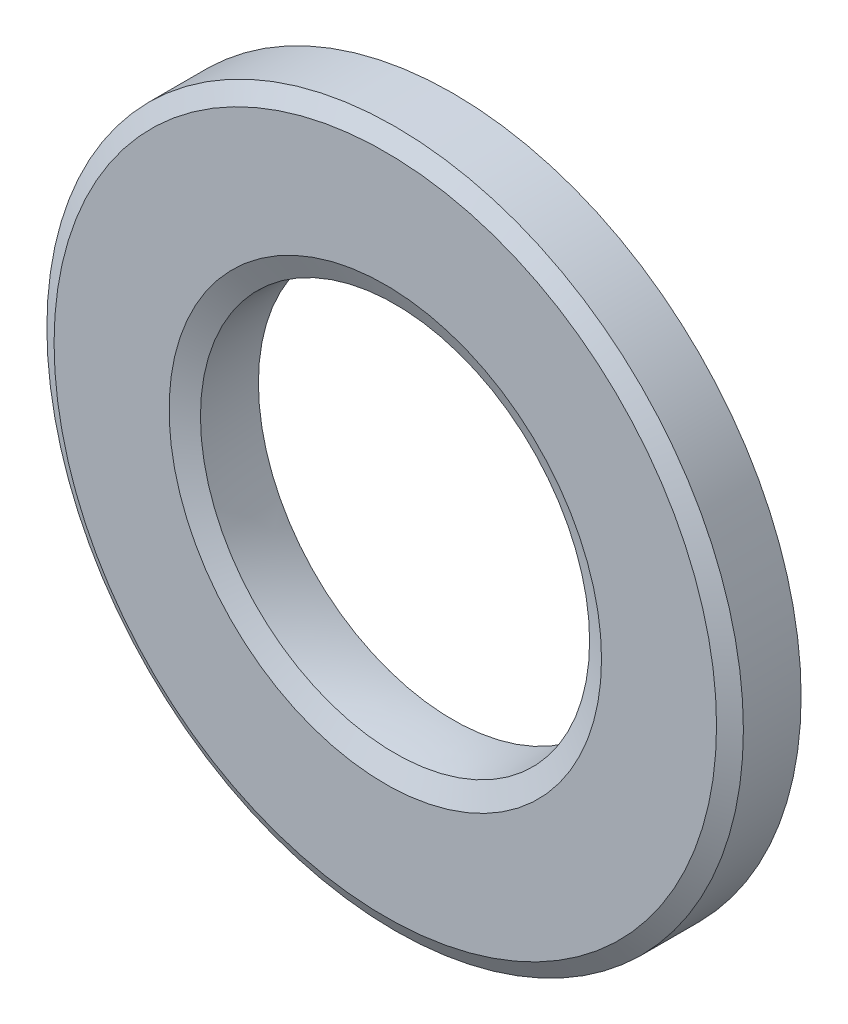
ISO-10303-21;
HEADER;
FILE_DESCRIPTION(('STEP AP214'),'2;1');
FILE_NAME('part.step','',(''),(''),'','','');
FILE_SCHEMA(('AUTOMOTIVE_DESIGN { 1 0 10303 214 1 1 1 1 }'));
ENDSEC;
DATA;
#1=APPLICATION_CONTEXT('core data for automotive mechanical design processes');
#2=APPLICATION_PROTOCOL_DEFINITION('international standard','automotive_design',2000,#1);
#3=PRODUCT_CONTEXT('',#1,'mechanical');
#4=PRODUCT('Part','Part','',(#3));
#5=PRODUCT_RELATED_PRODUCT_CATEGORY('part','',(#4));
#6=PRODUCT_DEFINITION_FORMATION('','',#4);
#7=PRODUCT_DEFINITION_CONTEXT('part definition',#1,'design');
#8=PRODUCT_DEFINITION('design','',#6,#7);
#9=PRODUCT_DEFINITION_SHAPE('','',#8);
#10=(LENGTH_UNIT() NAMED_UNIT(*) SI_UNIT(.MILLI.,.METRE.));
#11=(NAMED_UNIT(*) PLANE_ANGLE_UNIT() SI_UNIT($,.RADIAN.));
#12=(NAMED_UNIT(*) SI_UNIT($,.STERADIAN.) SOLID_ANGLE_UNIT());
#13=UNCERTAINTY_MEASURE_WITH_UNIT(LENGTH_MEASURE(1.E-05),#10,'distance_accuracy_value','');
#14=(GEOMETRIC_REPRESENTATION_CONTEXT(3) GLOBAL_UNCERTAINTY_ASSIGNED_CONTEXT((#13)) GLOBAL_UNIT_ASSIGNED_CONTEXT((#10,
#11,#12)) REPRESENTATION_CONTEXT('',''));
#15=CARTESIAN_POINT('',(0.,0.,0.));
#16=DIRECTION('',(0.,0.,1.));
#17=DIRECTION('',(1.,0.,0.));
#18=AXIS2_PLACEMENT_3D('',#15,#16,#17);
#19=CARTESIAN_POINT('',(0.,0.,0.999999999999996));
#20=DIRECTION('',(0.,0.,1.));
#21=DIRECTION('',(1.,0.,0.));
#22=AXIS2_PLACEMENT_3D('',#19,#20,#21);
#23=PLANE('',#22);
#24=CARTESIAN_POINT('',(0.,0.,0.999999999999996));
#25=DIRECTION('',(0.,0.,1.));
#26=DIRECTION('',(1.,0.,0.));
#27=AXIS2_PLACEMENT_3D('',#24,#25,#26);
#28=CIRCLE('',#27,5.58775294173801);
#29=CARTESIAN_POINT('',(5.58775294173801,0.,0.999999999999996));
#30=VERTEX_POINT('',#29);
#31=EDGE_CURVE('E10',#30,#30,#28,.F.);
#32=ORIENTED_EDGE('',*,*,#31,.T.);
#33=EDGE_LOOP('',(#32));
#34=FACE_BOUND('',#33,.T.);
#35=CARTESIAN_POINT('',(0.,0.,0.999999999999996));
#36=DIRECTION('',(0.,0.,1.));
#37=DIRECTION('',(1.,0.,0.));
#38=AXIS2_PLACEMENT_3D('',#35,#36,#37);
#39=CIRCLE('',#38,8.56005909487751);
#40=CARTESIAN_POINT('',(8.56005909487751,0.,0.999999999999996));
#41=VERTEX_POINT('',#40);
#42=EDGE_CURVE('E52',#41,#41,#39,.T.);
#43=ORIENTED_EDGE('',*,*,#42,.T.);
#44=EDGE_LOOP('',(#43));
#45=FACE_BOUND('',#44,.T.);
#46=ADVANCED_FACE('F32',(#34,#45),#23,.T.);
#47=CARTESIAN_POINT('',(0.,0.,0.999999999999996));
#48=DIRECTION('',(0.,0.,-1.));
#49=DIRECTION('',(-1.,0.,0.));
#50=AXIS2_PLACEMENT_3D('',#47,#48,#49);
#51=CYLINDRICAL_SURFACE('',#50,9.);
#52=CARTESIAN_POINT('',(0.,0.,-0.745999999999999));
#53=DIRECTION('',(0.,0.,1.));
#54=DIRECTION('',(1.,0.,0.));
#55=AXIS2_PLACEMENT_3D('',#52,#53,#54);
#56=CIRCLE('',#55,9.);
#57=CARTESIAN_POINT('',(9.,0.,-0.745999999999999));
#58=VERTEX_POINT('',#57);
#59=EDGE_CURVE('E58',#58,#58,#56,.T.);
#60=ORIENTED_EDGE('',*,*,#59,.T.);
#61=EDGE_LOOP('',(#60));
#62=FACE_BOUND('',#61,.T.);
#63=CARTESIAN_POINT('',(0.,0.,0.745999999999993));
#64=DIRECTION('',(0.,0.,1.));
#65=DIRECTION('',(1.,0.,0.));
#66=AXIS2_PLACEMENT_3D('',#63,#64,#65);
#67=CIRCLE('',#66,9.);
#68=CARTESIAN_POINT('',(9.,0.,0.745999999999993));
#69=VERTEX_POINT('',#68);
#70=EDGE_CURVE('E61',#69,#69,#67,.F.);
#71=ORIENTED_EDGE('',*,*,#70,.T.);
#72=EDGE_LOOP('',(#71));
#73=FACE_BOUND('',#72,.T.);
#74=ADVANCED_FACE('F65',(#62,#73),#51,.T.);
#75=CARTESIAN_POINT('',(0.,0.,-1.));
#76=DIRECTION('',(0.,0.,1.));
#77=DIRECTION('',(1.,0.,0.));
#78=AXIS2_PLACEMENT_3D('',#75,#76,#77);
#79=PLANE('',#78);
#80=CARTESIAN_POINT('',(0.,0.,-1.));
#81=DIRECTION('',(0.,0.,1.));
#82=DIRECTION('',(1.,0.,0.));
#83=AXIS2_PLACEMENT_3D('',#80,#81,#82);
#84=CIRCLE('',#83,5.58775294173802);
#85=CARTESIAN_POINT('',(5.58775294173802,0.,-1.));
#86=VERTEX_POINT('',#85);
#87=EDGE_CURVE('E47',#86,#86,#84,.T.);
#88=ORIENTED_EDGE('',*,*,#87,.T.);
#89=EDGE_LOOP('',(#88));
#90=FACE_BOUND('',#89,.T.);
#91=CARTESIAN_POINT('',(0.,0.,-1.));
#92=DIRECTION('',(0.,0.,1.));
#93=DIRECTION('',(1.,0.,0.));
#94=AXIS2_PLACEMENT_3D('',#91,#92,#93);
#95=CIRCLE('',#94,8.5600590948775);
#96=CARTESIAN_POINT('',(8.5600590948775,0.,-1.));
#97=VERTEX_POINT('',#96);
#98=EDGE_CURVE('E55',#97,#97,#95,.F.);
#99=ORIENTED_EDGE('',*,*,#98,.T.);
#100=EDGE_LOOP('',(#99));
#101=FACE_BOUND('',#100,.T.);
#102=ADVANCED_FACE('F80',(#90,#101),#79,.F.);
#103=CARTESIAN_POINT('',(0.,0.,-0.745999999999999));
#104=DIRECTION('',(0.,0.,1.));
#105=DIRECTION('',(1.,0.,0.));
#106=AXIS2_PLACEMENT_3D('',#103,#104,#105);
#107=CONICAL_SURFACE('',#106,9.,1.04719755119659);
#108=ORIENTED_EDGE('',*,*,#98,.F.);
#109=EDGE_LOOP('',(#108));
#110=FACE_BOUND('',#109,.T.);
#111=ORIENTED_EDGE('',*,*,#59,.F.);
#112=EDGE_LOOP('',(#111));
#113=FACE_BOUND('',#112,.T.);
#114=ADVANCED_FACE('F71',(#110,#113),#107,.T.);
#115=CARTESIAN_POINT('',(0.,0.,0.999999999999996));
#116=DIRECTION('',(0.,0.,-1.));
#117=DIRECTION('',(-1.,0.,0.));
#118=AXIS2_PLACEMENT_3D('',#115,#116,#117);
#119=CONICAL_SURFACE('',#118,8.56005909487751,1.04719755119659);
#120=ORIENTED_EDGE('',*,*,#70,.F.);
#121=EDGE_LOOP('',(#120));
#122=FACE_BOUND('',#121,.T.);
#123=ORIENTED_EDGE('',*,*,#42,.F.);
#124=EDGE_LOOP('',(#123));
#125=FACE_BOUND('',#124,.T.);
#126=ADVANCED_FACE('F67',(#122,#125),#119,.T.);
#127=CARTESIAN_POINT('',(0.,0.,0.));
#128=DIRECTION('',(0.,0.,1.));
#129=DIRECTION('',(0.,-1.,0.));
#130=AXIS2_PLACEMENT_3D('',#127,#128,#129);
#131=TOROIDAL_SURFACE('',#130,14.8679196850393,9.86791968503927);
#132=CARTESIAN_POINT('',(0.,0.,-0.748831629141166));
#133=DIRECTION('',(0.,0.,1.));
#134=DIRECTION('',(1.,0.,0.));
#135=AXIS2_PLACEMENT_3D('',#132,#133,#134);
#136=CIRCLE('',#135,5.02845373908553);
#137=CARTESIAN_POINT('',(5.02845373908553,0.,-0.748831629141166));
#138=VERTEX_POINT('',#137);
#139=EDGE_CURVE('E39',#138,#138,#136,.F.);
#140=ORIENTED_EDGE('',*,*,#139,.T.);
#141=EDGE_LOOP('',(#140));
#142=FACE_BOUND('',#141,.T.);
#143=CARTESIAN_POINT('',(0.,0.,0.748831629141162));
#144=DIRECTION('',(0.,0.,-1.));
#145=DIRECTION('',(-1.,0.,0.));
#146=AXIS2_PLACEMENT_3D('',#143,#144,#145);
#147=CIRCLE('',#146,5.02845373908553);
#148=CARTESIAN_POINT('',(-5.02845373908553,0.,0.748831629141162));
#149=VERTEX_POINT('',#148);
#150=EDGE_CURVE('E43',#149,#149,#147,.F.);
#151=ORIENTED_EDGE('',*,*,#150,.T.);
#152=EDGE_LOOP('',(#151));
#153=FACE_BOUND('',#152,.T.);
#154=ADVANCED_FACE('F70',(#142,#153),#131,.T.);
#155=CARTESIAN_POINT('',(0.,0.,-1.));
#156=DIRECTION('',(0.,0.,-1.));
#157=DIRECTION('',(-1.,0.,0.));
#158=AXIS2_PLACEMENT_3D('',#155,#156,#157);
#159=CONICAL_SURFACE('',#158,5.58775294173802,1.14871028859815);
#160=ORIENTED_EDGE('',*,*,#139,.F.);
#161=EDGE_LOOP('',(#160));
#162=FACE_BOUND('',#161,.T.);
#163=ORIENTED_EDGE('',*,*,#87,.F.);
#164=EDGE_LOOP('',(#163));
#165=FACE_BOUND('',#164,.T.);
#166=ADVANCED_FACE('F88',(#162,#165),#159,.F.);
#167=CARTESIAN_POINT('',(0.,0.,0.748831629141161));
#168=DIRECTION('',(0.,0.,1.));
#169=DIRECTION('',(1.,0.,0.));
#170=AXIS2_PLACEMENT_3D('',#167,#168,#169);
#171=CONICAL_SURFACE('',#170,5.02845373908553,1.14871028859814);
#172=ORIENTED_EDGE('',*,*,#31,.F.);
#173=EDGE_LOOP('',(#172));
#174=FACE_BOUND('',#173,.T.);
#175=ORIENTED_EDGE('',*,*,#150,.F.);
#176=EDGE_LOOP('',(#175));
#177=FACE_BOUND('',#176,.T.);
#178=ADVANCED_FACE('F34',(#174,#177),#171,.F.);
#179=CLOSED_SHELL('',(#46,#74,#102,#114,#126,#154,#166,#178));
#180=MANIFOLD_SOLID_BREP('B2',#179);
#181=ADVANCED_BREP_SHAPE_REPRESENTATION('',(#18,#180),#14);
#182=SHAPE_DEFINITION_REPRESENTATION(#9,#181);
ENDSEC;
END-ISO-10303-21;
